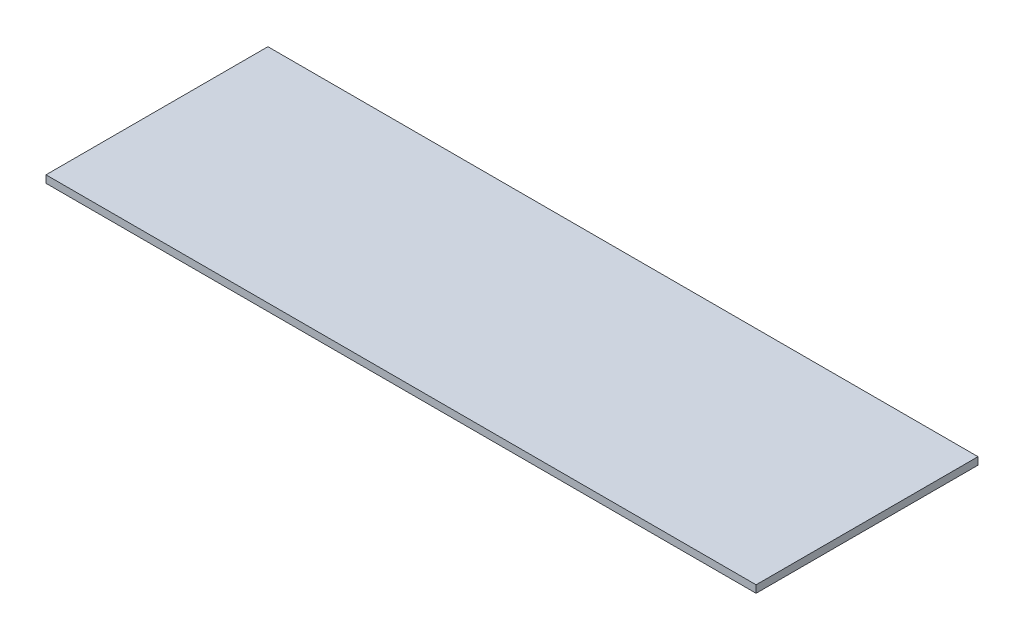
ISO-10303-21;
HEADER;
FILE_DESCRIPTION(('STEP AP214'),'2;1');
FILE_NAME('part.step','',(''),(''),'','','');
FILE_SCHEMA(('AUTOMOTIVE_DESIGN { 1 0 10303 214 1 1 1 1 }'));
ENDSEC;
DATA;
#1=APPLICATION_CONTEXT('core data for automotive mechanical design processes');
#2=APPLICATION_PROTOCOL_DEFINITION('international standard','automotive_design',2000,#1);
#3=PRODUCT_CONTEXT('',#1,'mechanical');
#4=PRODUCT('Part','Part','',(#3));
#5=PRODUCT_RELATED_PRODUCT_CATEGORY('part','',(#4));
#6=PRODUCT_DEFINITION_FORMATION('','',#4);
#7=PRODUCT_DEFINITION_CONTEXT('part definition',#1,'design');
#8=PRODUCT_DEFINITION('design','',#6,#7);
#9=PRODUCT_DEFINITION_SHAPE('','',#8);
#10=(LENGTH_UNIT() NAMED_UNIT(*) SI_UNIT(.MILLI.,.METRE.));
#11=(NAMED_UNIT(*) PLANE_ANGLE_UNIT() SI_UNIT($,.RADIAN.));
#12=(NAMED_UNIT(*) SI_UNIT($,.STERADIAN.) SOLID_ANGLE_UNIT());
#13=UNCERTAINTY_MEASURE_WITH_UNIT(LENGTH_MEASURE(1.E-05),#10,'distance_accuracy_value','');
#14=(GEOMETRIC_REPRESENTATION_CONTEXT(3) GLOBAL_UNCERTAINTY_ASSIGNED_CONTEXT((#13)) GLOBAL_UNIT_ASSIGNED_CONTEXT((#10,
#11,#12)) REPRESENTATION_CONTEXT('',''));
#15=CARTESIAN_POINT('',(0.,0.,0.));
#16=DIRECTION('',(0.,0.,1.));
#17=DIRECTION('',(1.,0.,0.));
#18=AXIS2_PLACEMENT_3D('',#15,#16,#17);
#19=CARTESIAN_POINT('',(0.,2.54,0.));
#20=DIRECTION('',(0.,0.,-1.));
#21=DIRECTION('',(-1.,0.,0.));
#22=AXIS2_PLACEMENT_3D('',#19,#20,#21);
#23=PLANE('',#22);
#24=DIRECTION('',(0.,1.,0.));
#25=VECTOR('',#24,1.);
#26=CARTESIAN_POINT('',(22.86,2.54,0.));
#27=LINE('',#26,#25);
#28=CARTESIAN_POINT('',(22.86,0.,0.));
#29=VERTEX_POINT('',#28);
#30=CARTESIAN_POINT('',(22.86,2.54,0.));
#31=VERTEX_POINT('',#30);
#32=EDGE_CURVE('E95',#29,#31,#27,.T.);
#33=ORIENTED_EDGE('',*,*,#32,.F.);
#34=DIRECTION('',(1.,0.,0.));
#35=VECTOR('',#34,1.);
#36=CARTESIAN_POINT('',(0.,0.,0.));
#37=LINE('',#36,#35);
#38=CARTESIAN_POINT('',(266.7,0.,0.));
#39=VERTEX_POINT('',#38);
#40=EDGE_CURVE('E78',#29,#39,#37,.T.);
#41=ORIENTED_EDGE('',*,*,#40,.T.);
#42=DIRECTION('',(0.,-1.,0.));
#43=VECTOR('',#42,1.);
#44=CARTESIAN_POINT('',(266.7,2.54,0.));
#45=LINE('',#44,#43);
#46=CARTESIAN_POINT('',(266.7,2.54,0.));
#47=VERTEX_POINT('',#46);
#48=EDGE_CURVE('E40',#47,#39,#45,.T.);
#49=ORIENTED_EDGE('',*,*,#48,.F.);
#50=DIRECTION('',(1.,0.,0.));
#51=VECTOR('',#50,1.);
#52=CARTESIAN_POINT('',(0.,2.54,0.));
#53=LINE('',#52,#51);
#54=EDGE_CURVE('E86',#31,#47,#53,.T.);
#55=ORIENTED_EDGE('',*,*,#54,.F.);
#56=EDGE_LOOP('',(#33,#41,#49,#55));
#57=FACE_BOUND('',#56,.T.);
#58=ADVANCED_FACE('F33',(#57),#23,.F.);
#59=CARTESIAN_POINT('',(0.,2.54,-76.2));
#60=DIRECTION('',(0.,0.,1.));
#61=DIRECTION('',(1.,0.,0.));
#62=AXIS2_PLACEMENT_3D('',#59,#60,#61);
#63=PLANE('',#62);
#64=DIRECTION('',(0.,-1.,0.));
#65=VECTOR('',#64,1.);
#66=CARTESIAN_POINT('',(22.86,2.54,-76.2));
#67=LINE('',#66,#65);
#68=CARTESIAN_POINT('',(22.86,2.54,-76.2));
#69=VERTEX_POINT('',#68);
#70=CARTESIAN_POINT('',(22.86,0.,-76.2));
#71=VERTEX_POINT('',#70);
#72=EDGE_CURVE('E47',#69,#71,#67,.T.);
#73=ORIENTED_EDGE('',*,*,#72,.F.);
#74=DIRECTION('',(-1.,0.,0.));
#75=VECTOR('',#74,1.);
#76=CARTESIAN_POINT('',(0.,2.54,-76.2));
#77=LINE('',#76,#75);
#78=CARTESIAN_POINT('',(266.7,2.54,-76.2));
#79=VERTEX_POINT('',#78);
#80=EDGE_CURVE('E83',#79,#69,#77,.T.);
#81=ORIENTED_EDGE('',*,*,#80,.F.);
#82=DIRECTION('',(0.,-1.,0.));
#83=VECTOR('',#82,1.);
#84=CARTESIAN_POINT('',(266.7,2.54,-76.2));
#85=LINE('',#84,#83);
#86=CARTESIAN_POINT('',(266.7,0.,-76.2));
#87=VERTEX_POINT('',#86);
#88=EDGE_CURVE('E71',#79,#87,#85,.T.);
#89=ORIENTED_EDGE('',*,*,#88,.T.);
#90=DIRECTION('',(-1.,0.,0.));
#91=VECTOR('',#90,1.);
#92=CARTESIAN_POINT('',(0.,0.,-76.2));
#93=LINE('',#92,#91);
#94=EDGE_CURVE('E77',#87,#71,#93,.T.);
#95=ORIENTED_EDGE('',*,*,#94,.T.);
#96=EDGE_LOOP('',(#73,#81,#89,#95));
#97=FACE_BOUND('',#96,.T.);
#98=ADVANCED_FACE('F82',(#97),#63,.F.);
#99=CARTESIAN_POINT('',(0.,2.54,0.));
#100=DIRECTION('',(0.,-1.,0.));
#101=DIRECTION('',(0.,0.,-1.));
#102=AXIS2_PLACEMENT_3D('',#99,#100,#101);
#103=PLANE('',#102);
#104=DIRECTION('',(0.,0.,-1.));
#105=VECTOR('',#104,1.);
#106=CARTESIAN_POINT('',(22.86,2.54,0.));
#107=LINE('',#106,#105);
#108=EDGE_CURVE('E91',#31,#69,#107,.T.);
#109=ORIENTED_EDGE('',*,*,#108,.F.);
#110=ORIENTED_EDGE('',*,*,#54,.T.);
#111=DIRECTION('',(0.,0.,-1.));
#112=VECTOR('',#111,1.);
#113=CARTESIAN_POINT('',(266.7,2.54,0.));
#114=LINE('',#113,#112);
#115=EDGE_CURVE('E55',#47,#79,#114,.T.);
#116=ORIENTED_EDGE('',*,*,#115,.T.);
#117=ORIENTED_EDGE('',*,*,#80,.T.);
#118=EDGE_LOOP('',(#109,#110,#116,#117));
#119=FACE_BOUND('',#118,.T.);
#120=ADVANCED_FACE('F105',(#119),#103,.F.);
#121=CARTESIAN_POINT('',(0.,0.,0.));
#122=DIRECTION('',(0.,-1.,0.));
#123=DIRECTION('',(0.,0.,-1.));
#124=AXIS2_PLACEMENT_3D('',#121,#122,#123);
#125=PLANE('',#124);
#126=ORIENTED_EDGE('',*,*,#40,.F.);
#127=DIRECTION('',(0.,0.,-1.));
#128=VECTOR('',#127,1.);
#129=CARTESIAN_POINT('',(22.86,0.,0.));
#130=LINE('',#129,#128);
#131=EDGE_CURVE('E11',#29,#71,#130,.T.);
#132=ORIENTED_EDGE('',*,*,#131,.T.);
#133=ORIENTED_EDGE('',*,*,#94,.F.);
#134=DIRECTION('',(0.,0.,-1.));
#135=VECTOR('',#134,1.);
#136=CARTESIAN_POINT('',(266.7,0.,0.));
#137=LINE('',#136,#135);
#138=EDGE_CURVE('E68',#39,#87,#137,.T.);
#139=ORIENTED_EDGE('',*,*,#138,.F.);
#140=EDGE_LOOP('',(#126,#132,#133,#139));
#141=FACE_BOUND('',#140,.T.);
#142=ADVANCED_FACE('F85',(#141),#125,.T.);
#143=CARTESIAN_POINT('',(266.7,2.54,0.));
#144=DIRECTION('',(-1.,0.,0.));
#145=DIRECTION('',(0.,0.,1.));
#146=AXIS2_PLACEMENT_3D('',#143,#144,#145);
#147=PLANE('',#146);
#148=ORIENTED_EDGE('',*,*,#138,.T.);
#149=ORIENTED_EDGE('',*,*,#88,.F.);
#150=ORIENTED_EDGE('',*,*,#115,.F.);
#151=ORIENTED_EDGE('',*,*,#48,.T.);
#152=EDGE_LOOP('',(#148,#149,#150,#151));
#153=FACE_BOUND('',#152,.T.);
#154=ADVANCED_FACE('F70',(#153),#147,.F.);
#155=CARTESIAN_POINT('',(22.86,0.,0.));
#156=DIRECTION('',(-1.,0.,0.));
#157=DIRECTION('',(0.,0.,1.));
#158=AXIS2_PLACEMENT_3D('',#155,#156,#157);
#159=PLANE('',#158);
#160=ORIENTED_EDGE('',*,*,#108,.T.);
#161=ORIENTED_EDGE('',*,*,#72,.T.);
#162=ORIENTED_EDGE('',*,*,#131,.F.);
#163=ORIENTED_EDGE('',*,*,#32,.T.);
#164=EDGE_LOOP('',(#160,#161,#162,#163));
#165=FACE_BOUND('',#164,.T.);
#166=ADVANCED_FACE('F100',(#165),#159,.T.);
#167=CLOSED_SHELL('',(#58,#98,#120,#142,#154,#166));
#168=MANIFOLD_SOLID_BREP('B2',#167);
#169=ADVANCED_BREP_SHAPE_REPRESENTATION('',(#18,#168),#14);
#170=SHAPE_DEFINITION_REPRESENTATION(#9,#169);
ENDSEC;
END-ISO-10303-21;
